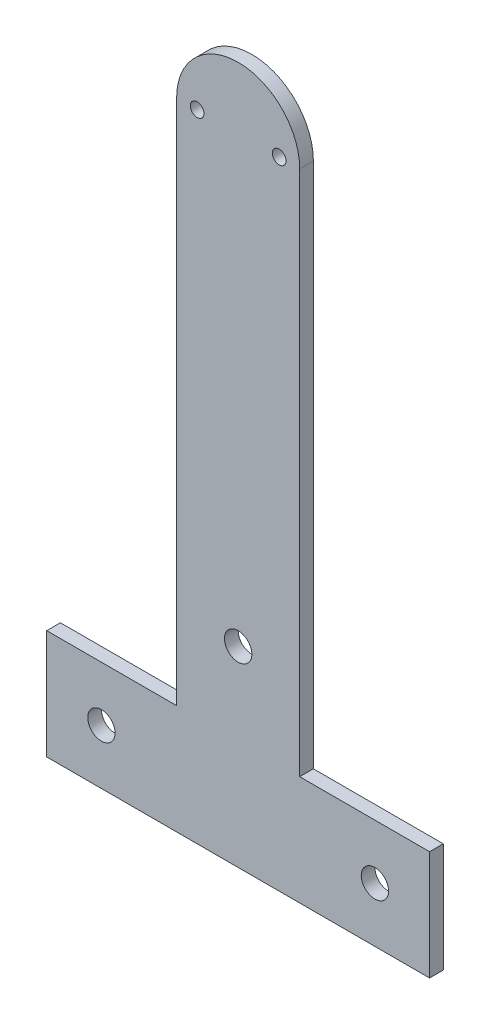
ISO-10303-21;
HEADER;
FILE_DESCRIPTION(('STEP AP214'),'2;1');
FILE_NAME('part.step','',(''),(''),'','','');
FILE_SCHEMA(('AUTOMOTIVE_DESIGN { 1 0 10303 214 1 1 1 1 }'));
ENDSEC;
DATA;
#1=APPLICATION_CONTEXT('core data for automotive mechanical design processes');
#2=APPLICATION_PROTOCOL_DEFINITION('international standard','automotive_design',2000,#1);
#3=PRODUCT_CONTEXT('',#1,'mechanical');
#4=PRODUCT('Part','Part','',(#3));
#5=PRODUCT_RELATED_PRODUCT_CATEGORY('part','',(#4));
#6=PRODUCT_DEFINITION_FORMATION('','',#4);
#7=PRODUCT_DEFINITION_CONTEXT('part definition',#1,'design');
#8=PRODUCT_DEFINITION('design','',#6,#7);
#9=PRODUCT_DEFINITION_SHAPE('','',#8);
#10=(LENGTH_UNIT() NAMED_UNIT(*) SI_UNIT(.MILLI.,.METRE.));
#11=(NAMED_UNIT(*) PLANE_ANGLE_UNIT() SI_UNIT($,.RADIAN.));
#12=(NAMED_UNIT(*) SI_UNIT($,.STERADIAN.) SOLID_ANGLE_UNIT());
#13=UNCERTAINTY_MEASURE_WITH_UNIT(LENGTH_MEASURE(1.E-05),#10,'distance_accuracy_value','');
#14=(GEOMETRIC_REPRESENTATION_CONTEXT(3) GLOBAL_UNCERTAINTY_ASSIGNED_CONTEXT((#13)) GLOBAL_UNIT_ASSIGNED_CONTEXT((#10,
#11,#12)) REPRESENTATION_CONTEXT('',''));
#15=CARTESIAN_POINT('',(0.,0.,0.));
#16=DIRECTION('',(0.,0.,1.));
#17=DIRECTION('',(1.,0.,0.));
#18=AXIS2_PLACEMENT_3D('',#15,#16,#17);
#19=CARTESIAN_POINT('',(-13.3404490284892,112.565520937774,2.));
#20=DIRECTION('',(0.,0.,-1.));
#21=DIRECTION('',(-1.,0.,0.));
#22=AXIS2_PLACEMENT_3D('',#19,#20,#21);
#23=PLANE('',#22);
#24=DIRECTION('',(1.,0.,0.));
#25=VECTOR('',#24,1.);
#26=CARTESIAN_POINT('',(-41.3404490284892,19.5655209377735,2.));
#27=LINE('',#26,#25);
#28=CARTESIAN_POINT('',(-41.3404490284892,19.5655209377735,2.));
#29=VERTEX_POINT('',#28);
#30=CARTESIAN_POINT('',(14.6595509715108,19.5655209377735,2.));
#31=VERTEX_POINT('',#30);
#32=EDGE_CURVE('E164',#29,#31,#27,.T.);
#33=ORIENTED_EDGE('',*,*,#32,.T.);
#34=DIRECTION('',(0.,1.,0.));
#35=VECTOR('',#34,1.);
#36=CARTESIAN_POINT('',(14.6595509715108,19.5655209377735,2.));
#37=LINE('',#36,#35);
#38=CARTESIAN_POINT('',(14.6595509715108,35.5655209377735,2.));
#39=VERTEX_POINT('',#38);
#40=EDGE_CURVE('E100',#31,#39,#37,.T.);
#41=ORIENTED_EDGE('',*,*,#40,.T.);
#42=DIRECTION('',(-1.,0.,0.));
#43=VECTOR('',#42,1.);
#44=CARTESIAN_POINT('',(-4.34044902848922,35.5655209377735,2.));
#45=LINE('',#44,#43);
#46=CARTESIAN_POINT('',(-4.34044902848922,35.5655209377735,2.));
#47=VERTEX_POINT('',#46);
#48=EDGE_CURVE('E185',#39,#47,#45,.T.);
#49=ORIENTED_EDGE('',*,*,#48,.T.);
#50=DIRECTION('',(0.,1.,0.));
#51=VECTOR('',#50,1.);
#52=CARTESIAN_POINT('',(-4.34044902848921,112.565520937774,2.));
#53=LINE('',#52,#51);
#54=CARTESIAN_POINT('',(-4.34044902848921,112.565520937774,2.));
#55=VERTEX_POINT('',#54);
#56=EDGE_CURVE('E199',#47,#55,#53,.T.);
#57=ORIENTED_EDGE('',*,*,#56,.T.);
#58=CARTESIAN_POINT('',(-13.3404490284892,112.565520937774,2.));
#59=DIRECTION('',(0.,0.,1.));
#60=DIRECTION('',(-1.,0.,0.));
#61=AXIS2_PLACEMENT_3D('',#58,#59,#60);
#62=CIRCLE('',#61,9.00000000000001);
#63=CARTESIAN_POINT('',(-22.3404490284892,112.565520937774,2.));
#64=VERTEX_POINT('',#63);
#65=EDGE_CURVE('E119',#55,#64,#62,.T.);
#66=ORIENTED_EDGE('',*,*,#65,.T.);
#67=DIRECTION('',(0.,-1.,0.));
#68=VECTOR('',#67,1.);
#69=CARTESIAN_POINT('',(-22.3404490284892,112.565520937774,2.));
#70=LINE('',#69,#68);
#71=CARTESIAN_POINT('',(-22.3404490284892,35.5655209377735,2.));
#72=VERTEX_POINT('',#71);
#73=EDGE_CURVE('E113',#64,#72,#70,.T.);
#74=ORIENTED_EDGE('',*,*,#73,.T.);
#75=DIRECTION('',(-1.,0.,0.));
#76=VECTOR('',#75,1.);
#77=CARTESIAN_POINT('',(-41.3404490284892,35.5655209377735,2.));
#78=LINE('',#77,#76);
#79=CARTESIAN_POINT('',(-41.3404490284892,35.5655209377735,2.));
#80=VERTEX_POINT('',#79);
#81=EDGE_CURVE('E117',#72,#80,#78,.T.);
#82=ORIENTED_EDGE('',*,*,#81,.T.);
#83=DIRECTION('',(0.,-1.,0.));
#84=VECTOR('',#83,1.);
#85=CARTESIAN_POINT('',(-41.3404490284892,19.5655209377735,2.));
#86=LINE('',#85,#84);
#87=EDGE_CURVE('E57',#80,#29,#86,.T.);
#88=ORIENTED_EDGE('',*,*,#87,.T.);
#89=EDGE_LOOP('',(#33,#41,#49,#57,#66,#74,#82,#88));
#90=FACE_BOUND('',#89,.T.);
#91=CARTESIAN_POINT('',(-33.3404490284892,27.5655209377735,2.));
#92=DIRECTION('',(0.,0.,1.));
#93=DIRECTION('',(1.,0.,0.));
#94=AXIS2_PLACEMENT_3D('',#91,#92,#93);
#95=CIRCLE('',#94,2.);
#96=CARTESIAN_POINT('',(-31.3404490284892,27.5655209377735,2.));
#97=VERTEX_POINT('',#96);
#98=EDGE_CURVE('E146',#97,#97,#95,.T.);
#99=ORIENTED_EDGE('',*,*,#98,.F.);
#100=EDGE_LOOP('',(#99));
#101=FACE_BOUND('',#100,.T.);
#102=CARTESIAN_POINT('',(6.65955097151078,27.5655209377735,2.));
#103=DIRECTION('',(0.,0.,1.));
#104=DIRECTION('',(-1.,0.,0.));
#105=AXIS2_PLACEMENT_3D('',#102,#103,#104);
#106=CIRCLE('',#105,2.00000000000001);
#107=CARTESIAN_POINT('',(4.65955097151077,27.5655209377735,2.));
#108=VERTEX_POINT('',#107);
#109=EDGE_CURVE('E213',#108,#108,#106,.T.);
#110=ORIENTED_EDGE('',*,*,#109,.F.);
#111=EDGE_LOOP('',(#110));
#112=FACE_BOUND('',#111,.T.);
#113=CARTESIAN_POINT('',(-7.34044902848922,112.565520937774,2.));
#114=DIRECTION('',(0.,0.,1.));
#115=DIRECTION('',(1.,0.,0.));
#116=AXIS2_PLACEMENT_3D('',#113,#114,#115);
#117=CIRCLE('',#116,1.);
#118=CARTESIAN_POINT('',(-6.34044902848922,112.565520937774,2.));
#119=VERTEX_POINT('',#118);
#120=EDGE_CURVE('E221',#119,#119,#117,.T.);
#121=ORIENTED_EDGE('',*,*,#120,.F.);
#122=EDGE_LOOP('',(#121));
#123=FACE_BOUND('',#122,.T.);
#124=CARTESIAN_POINT('',(-19.3404490284892,112.565520937774,2.));
#125=DIRECTION('',(0.,0.,1.));
#126=DIRECTION('',(-1.,0.,0.));
#127=AXIS2_PLACEMENT_3D('',#124,#125,#126);
#128=CIRCLE('',#127,1.);
#129=CARTESIAN_POINT('',(-20.3404490284892,112.565520937774,2.));
#130=VERTEX_POINT('',#129);
#131=EDGE_CURVE('E229',#130,#130,#128,.T.);
#132=ORIENTED_EDGE('',*,*,#131,.F.);
#133=EDGE_LOOP('',(#132));
#134=FACE_BOUND('',#133,.T.);
#135=CARTESIAN_POINT('',(-13.3404490284892,47.5655209377735,2.));
#136=DIRECTION('',(0.,0.,1.));
#137=DIRECTION('',(1.,0.,0.));
#138=AXIS2_PLACEMENT_3D('',#135,#136,#137);
#139=CIRCLE('',#138,2.00000000000001);
#140=CARTESIAN_POINT('',(-11.3404490284892,47.5655209377735,2.));
#141=VERTEX_POINT('',#140);
#142=EDGE_CURVE('E237',#141,#141,#139,.T.);
#143=ORIENTED_EDGE('',*,*,#142,.F.);
#144=EDGE_LOOP('',(#143));
#145=FACE_BOUND('',#144,.T.);
#146=ADVANCED_FACE('F39',(#90,#101,#112,#123,#134,#145),#23,.F.);
#147=CARTESIAN_POINT('',(-13.3404490284892,112.565520937774,0.));
#148=DIRECTION('',(0.,0.,-1.));
#149=DIRECTION('',(-1.,0.,0.));
#150=AXIS2_PLACEMENT_3D('',#147,#148,#149);
#151=PLANE('',#150);
#152=CARTESIAN_POINT('',(-19.3404490284892,112.565520937774,0.));
#153=DIRECTION('',(0.,0.,1.));
#154=DIRECTION('',(-1.,0.,0.));
#155=AXIS2_PLACEMENT_3D('',#152,#153,#154);
#156=CIRCLE('',#155,1.);
#157=CARTESIAN_POINT('',(-20.3404490284892,112.565520937774,0.));
#158=VERTEX_POINT('',#157);
#159=EDGE_CURVE('E233',#158,#158,#156,.T.);
#160=ORIENTED_EDGE('',*,*,#159,.T.);
#161=EDGE_LOOP('',(#160));
#162=FACE_BOUND('',#161,.T.);
#163=CARTESIAN_POINT('',(6.65955097151078,27.5655209377735,0.));
#164=DIRECTION('',(0.,0.,1.));
#165=DIRECTION('',(-1.,0.,0.));
#166=AXIS2_PLACEMENT_3D('',#163,#164,#165);
#167=CIRCLE('',#166,2.00000000000001);
#168=CARTESIAN_POINT('',(4.65955097151077,27.5655209377735,0.));
#169=VERTEX_POINT('',#168);
#170=EDGE_CURVE('E217',#169,#169,#167,.T.);
#171=ORIENTED_EDGE('',*,*,#170,.T.);
#172=EDGE_LOOP('',(#171));
#173=FACE_BOUND('',#172,.T.);
#174=DIRECTION('',(1.,0.,0.));
#175=VECTOR('',#174,1.);
#176=CARTESIAN_POINT('',(-41.3404490284892,19.5655209377735,0.));
#177=LINE('',#176,#175);
#178=CARTESIAN_POINT('',(-41.3404490284892,19.5655209377735,0.));
#179=VERTEX_POINT('',#178);
#180=CARTESIAN_POINT('',(14.6595509715108,19.5655209377735,0.));
#181=VERTEX_POINT('',#180);
#182=EDGE_CURVE('E141',#179,#181,#177,.T.);
#183=ORIENTED_EDGE('',*,*,#182,.F.);
#184=DIRECTION('',(0.,-1.,0.));
#185=VECTOR('',#184,1.);
#186=CARTESIAN_POINT('',(-41.3404490284892,19.5655209377735,0.));
#187=LINE('',#186,#185);
#188=CARTESIAN_POINT('',(-41.3404490284892,35.5655209377735,0.));
#189=VERTEX_POINT('',#188);
#190=EDGE_CURVE('E92',#189,#179,#187,.T.);
#191=ORIENTED_EDGE('',*,*,#190,.F.);
#192=DIRECTION('',(-1.,0.,0.));
#193=VECTOR('',#192,1.);
#194=CARTESIAN_POINT('',(-41.3404490284892,35.5655209377735,0.));
#195=LINE('',#194,#193);
#196=CARTESIAN_POINT('',(-22.3404490284892,35.5655209377735,0.));
#197=VERTEX_POINT('',#196);
#198=EDGE_CURVE('E86',#197,#189,#195,.T.);
#199=ORIENTED_EDGE('',*,*,#198,.F.);
#200=DIRECTION('',(0.,-1.,0.));
#201=VECTOR('',#200,1.);
#202=CARTESIAN_POINT('',(-22.3404490284892,112.565520937774,0.));
#203=LINE('',#202,#201);
#204=CARTESIAN_POINT('',(-22.3404490284892,112.565520937774,0.));
#205=VERTEX_POINT('',#204);
#206=EDGE_CURVE('E128',#205,#197,#203,.T.);
#207=ORIENTED_EDGE('',*,*,#206,.F.);
#208=CARTESIAN_POINT('',(-13.3404490284892,112.565520937774,0.));
#209=DIRECTION('',(0.,0.,1.));
#210=DIRECTION('',(-1.,0.,0.));
#211=AXIS2_PLACEMENT_3D('',#208,#209,#210);
#212=CIRCLE('',#211,9.00000000000001);
#213=CARTESIAN_POINT('',(-4.34044902848921,112.565520937774,0.));
#214=VERTEX_POINT('',#213);
#215=EDGE_CURVE('E155',#214,#205,#212,.T.);
#216=ORIENTED_EDGE('',*,*,#215,.F.);
#217=DIRECTION('',(0.,1.,0.));
#218=VECTOR('',#217,1.);
#219=CARTESIAN_POINT('',(-4.34044902848921,112.565520937774,0.));
#220=LINE('',#219,#218);
#221=CARTESIAN_POINT('',(-4.34044902848922,35.5655209377735,0.));
#222=VERTEX_POINT('',#221);
#223=EDGE_CURVE('E152',#222,#214,#220,.T.);
#224=ORIENTED_EDGE('',*,*,#223,.F.);
#225=DIRECTION('',(-1.,0.,0.));
#226=VECTOR('',#225,1.);
#227=CARTESIAN_POINT('',(-4.34044902848922,35.5655209377735,0.));
#228=LINE('',#227,#226);
#229=CARTESIAN_POINT('',(14.6595509715108,35.5655209377735,0.));
#230=VERTEX_POINT('',#229);
#231=EDGE_CURVE('E149',#230,#222,#228,.T.);
#232=ORIENTED_EDGE('',*,*,#231,.F.);
#233=DIRECTION('',(0.,1.,0.));
#234=VECTOR('',#233,1.);
#235=CARTESIAN_POINT('',(14.6595509715108,19.5655209377735,0.));
#236=LINE('',#235,#234);
#237=EDGE_CURVE('E145',#181,#230,#236,.T.);
#238=ORIENTED_EDGE('',*,*,#237,.F.);
#239=EDGE_LOOP('',(#183,#191,#199,#207,#216,#224,#232,#238));
#240=FACE_BOUND('',#239,.T.);
#241=CARTESIAN_POINT('',(-33.3404490284892,27.5655209377735,0.));
#242=DIRECTION('',(0.,0.,1.));
#243=DIRECTION('',(1.,0.,0.));
#244=AXIS2_PLACEMENT_3D('',#241,#242,#243);
#245=CIRCLE('',#244,2.);
#246=CARTESIAN_POINT('',(-31.3404490284892,27.5655209377735,0.));
#247=VERTEX_POINT('',#246);
#248=EDGE_CURVE('E209',#247,#247,#245,.T.);
#249=ORIENTED_EDGE('',*,*,#248,.T.);
#250=EDGE_LOOP('',(#249));
#251=FACE_BOUND('',#250,.T.);
#252=CARTESIAN_POINT('',(-7.34044902848922,112.565520937774,0.));
#253=DIRECTION('',(0.,0.,1.));
#254=DIRECTION('',(1.,0.,0.));
#255=AXIS2_PLACEMENT_3D('',#252,#253,#254);
#256=CIRCLE('',#255,1.);
#257=CARTESIAN_POINT('',(-6.34044902848922,112.565520937774,0.));
#258=VERTEX_POINT('',#257);
#259=EDGE_CURVE('E225',#258,#258,#256,.T.);
#260=ORIENTED_EDGE('',*,*,#259,.T.);
#261=EDGE_LOOP('',(#260));
#262=FACE_BOUND('',#261,.T.);
#263=CARTESIAN_POINT('',(-13.3404490284892,47.5655209377735,0.));
#264=DIRECTION('',(0.,0.,1.));
#265=DIRECTION('',(1.,0.,0.));
#266=AXIS2_PLACEMENT_3D('',#263,#264,#265);
#267=CIRCLE('',#266,2.00000000000001);
#268=CARTESIAN_POINT('',(-11.3404490284892,47.5655209377735,0.));
#269=VERTEX_POINT('',#268);
#270=EDGE_CURVE('E241',#269,#269,#267,.T.);
#271=ORIENTED_EDGE('',*,*,#270,.T.);
#272=EDGE_LOOP('',(#271));
#273=FACE_BOUND('',#272,.T.);
#274=ADVANCED_FACE('F189',(#162,#173,#240,#251,#262,#273),#151,.T.);
#275=CARTESIAN_POINT('',(-41.3404490284892,19.5655209377735,2.));
#276=DIRECTION('',(0.,1.,0.));
#277=DIRECTION('',(0.,0.,1.));
#278=AXIS2_PLACEMENT_3D('',#275,#276,#277);
#279=PLANE('',#278);
#280=ORIENTED_EDGE('',*,*,#182,.T.);
#281=DIRECTION('',(0.,0.,-1.));
#282=VECTOR('',#281,1.);
#283=CARTESIAN_POINT('',(14.6595509715108,19.5655209377735,2.));
#284=LINE('',#283,#282);
#285=EDGE_CURVE('E11',#31,#181,#284,.T.);
#286=ORIENTED_EDGE('',*,*,#285,.F.);
#287=ORIENTED_EDGE('',*,*,#32,.F.);
#288=DIRECTION('',(0.,0.,-1.));
#289=VECTOR('',#288,1.);
#290=CARTESIAN_POINT('',(-41.3404490284892,19.5655209377735,2.));
#291=LINE('',#290,#289);
#292=EDGE_CURVE('E137',#29,#179,#291,.T.);
#293=ORIENTED_EDGE('',*,*,#292,.T.);
#294=EDGE_LOOP('',(#280,#286,#287,#293));
#295=FACE_BOUND('',#294,.T.);
#296=ADVANCED_FACE('F41',(#295),#279,.F.);
#297=CARTESIAN_POINT('',(14.6595509715108,19.5655209377735,2.));
#298=DIRECTION('',(-1.,0.,0.));
#299=DIRECTION('',(0.,0.,1.));
#300=AXIS2_PLACEMENT_3D('',#297,#298,#299);
#301=PLANE('',#300);
#302=ORIENTED_EDGE('',*,*,#237,.T.);
#303=DIRECTION('',(0.,0.,-1.));
#304=VECTOR('',#303,1.);
#305=CARTESIAN_POINT('',(14.6595509715108,35.5655209377735,2.));
#306=LINE('',#305,#304);
#307=EDGE_CURVE('E49',#39,#230,#306,.T.);
#308=ORIENTED_EDGE('',*,*,#307,.F.);
#309=ORIENTED_EDGE('',*,*,#40,.F.);
#310=ORIENTED_EDGE('',*,*,#285,.T.);
#311=EDGE_LOOP('',(#302,#308,#309,#310));
#312=FACE_BOUND('',#311,.T.);
#313=ADVANCED_FACE('F275',(#312),#301,.F.);
#314=CARTESIAN_POINT('',(-4.34044902848922,35.5655209377735,2.));
#315=DIRECTION('',(0.,-1.,0.));
#316=DIRECTION('',(0.,0.,-1.));
#317=AXIS2_PLACEMENT_3D('',#314,#315,#316);
#318=PLANE('',#317);
#319=ORIENTED_EDGE('',*,*,#231,.T.);
#320=DIRECTION('',(0.,0.,-1.));
#321=VECTOR('',#320,1.);
#322=CARTESIAN_POINT('',(-4.34044902848922,35.5655209377735,2.));
#323=LINE('',#322,#321);
#324=EDGE_CURVE('E175',#47,#222,#323,.T.);
#325=ORIENTED_EDGE('',*,*,#324,.F.);
#326=ORIENTED_EDGE('',*,*,#48,.F.);
#327=ORIENTED_EDGE('',*,*,#307,.T.);
#328=EDGE_LOOP('',(#319,#325,#326,#327));
#329=FACE_BOUND('',#328,.T.);
#330=ADVANCED_FACE('F183',(#329),#318,.F.);
#331=CARTESIAN_POINT('',(-4.34044902848921,112.565520937774,2.));
#332=DIRECTION('',(-1.,0.,0.));
#333=DIRECTION('',(0.,-1.,0.));
#334=AXIS2_PLACEMENT_3D('',#331,#332,#333);
#335=PLANE('',#334);
#336=ORIENTED_EDGE('',*,*,#223,.T.);
#337=DIRECTION('',(0.,0.,-1.));
#338=VECTOR('',#337,1.);
#339=CARTESIAN_POINT('',(-4.34044902848921,112.565520937774,2.));
#340=LINE('',#339,#338);
#341=EDGE_CURVE('E171',#55,#214,#340,.T.);
#342=ORIENTED_EDGE('',*,*,#341,.F.);
#343=ORIENTED_EDGE('',*,*,#56,.F.);
#344=ORIENTED_EDGE('',*,*,#324,.T.);
#345=EDGE_LOOP('',(#336,#342,#343,#344));
#346=FACE_BOUND('',#345,.T.);
#347=ADVANCED_FACE('F194',(#346),#335,.F.);
#348=CARTESIAN_POINT('',(-13.3404490284892,112.565520937774,2.));
#349=DIRECTION('',(0.,0.,-1.));
#350=DIRECTION('',(-1.,0.,0.));
#351=AXIS2_PLACEMENT_3D('',#348,#349,#350);
#352=CYLINDRICAL_SURFACE('',#351,9.00000000000001);
#353=ORIENTED_EDGE('',*,*,#215,.T.);
#354=DIRECTION('',(0.,0.,-1.));
#355=VECTOR('',#354,1.);
#356=CARTESIAN_POINT('',(-22.3404490284892,112.565520937774,2.));
#357=LINE('',#356,#355);
#358=EDGE_CURVE('E130',#64,#205,#357,.T.);
#359=ORIENTED_EDGE('',*,*,#358,.F.);
#360=ORIENTED_EDGE('',*,*,#65,.F.);
#361=ORIENTED_EDGE('',*,*,#341,.T.);
#362=EDGE_LOOP('',(#353,#359,#360,#361));
#363=FACE_BOUND('',#362,.T.);
#364=ADVANCED_FACE('F197',(#363),#352,.T.);
#365=CARTESIAN_POINT('',(-22.3404490284892,112.565520937774,2.));
#366=DIRECTION('',(1.,0.,0.));
#367=DIRECTION('',(0.,1.,0.));
#368=AXIS2_PLACEMENT_3D('',#365,#366,#367);
#369=PLANE('',#368);
#370=ORIENTED_EDGE('',*,*,#206,.T.);
#371=DIRECTION('',(0.,0.,-1.));
#372=VECTOR('',#371,1.);
#373=CARTESIAN_POINT('',(-22.3404490284892,35.5655209377735,2.));
#374=LINE('',#373,#372);
#375=EDGE_CURVE('E125',#72,#197,#374,.T.);
#376=ORIENTED_EDGE('',*,*,#375,.F.);
#377=ORIENTED_EDGE('',*,*,#73,.F.);
#378=ORIENTED_EDGE('',*,*,#358,.T.);
#379=EDGE_LOOP('',(#370,#376,#377,#378));
#380=FACE_BOUND('',#379,.T.);
#381=ADVANCED_FACE('F126',(#380),#369,.F.);
#382=CARTESIAN_POINT('',(-41.3404490284892,35.5655209377735,2.));
#383=DIRECTION('',(0.,-1.,0.));
#384=DIRECTION('',(0.,0.,-1.));
#385=AXIS2_PLACEMENT_3D('',#382,#383,#384);
#386=PLANE('',#385);
#387=ORIENTED_EDGE('',*,*,#198,.T.);
#388=DIRECTION('',(0.,0.,-1.));
#389=VECTOR('',#388,1.);
#390=CARTESIAN_POINT('',(-41.3404490284892,35.5655209377735,2.));
#391=LINE('',#390,#389);
#392=EDGE_CURVE('E131',#80,#189,#391,.T.);
#393=ORIENTED_EDGE('',*,*,#392,.F.);
#394=ORIENTED_EDGE('',*,*,#81,.F.);
#395=ORIENTED_EDGE('',*,*,#375,.T.);
#396=EDGE_LOOP('',(#387,#393,#394,#395));
#397=FACE_BOUND('',#396,.T.);
#398=ADVANCED_FACE('F133',(#397),#386,.F.);
#399=CARTESIAN_POINT('',(-41.3404490284892,19.5655209377735,2.));
#400=DIRECTION('',(1.,0.,0.));
#401=DIRECTION('',(0.,0.,-1.));
#402=AXIS2_PLACEMENT_3D('',#399,#400,#401);
#403=PLANE('',#402);
#404=ORIENTED_EDGE('',*,*,#190,.T.);
#405=ORIENTED_EDGE('',*,*,#292,.F.);
#406=ORIENTED_EDGE('',*,*,#87,.F.);
#407=ORIENTED_EDGE('',*,*,#392,.T.);
#408=EDGE_LOOP('',(#404,#405,#406,#407));
#409=FACE_BOUND('',#408,.T.);
#410=ADVANCED_FACE('F263',(#409),#403,.F.);
#411=CARTESIAN_POINT('',(-33.3404490284892,27.5655209377735,2.));
#412=DIRECTION('',(0.,0.,-1.));
#413=DIRECTION('',(-1.,0.,0.));
#414=AXIS2_PLACEMENT_3D('',#411,#412,#413);
#415=CYLINDRICAL_SURFACE('',#414,2.);
#416=ORIENTED_EDGE('',*,*,#98,.T.);
#417=EDGE_LOOP('',(#416));
#418=FACE_BOUND('',#417,.T.);
#419=ORIENTED_EDGE('',*,*,#248,.F.);
#420=EDGE_LOOP('',(#419));
#421=FACE_BOUND('',#420,.T.);
#422=ADVANCED_FACE('F260',(#418,#421),#415,.F.);
#423=CARTESIAN_POINT('',(6.65955097151078,27.5655209377735,2.));
#424=DIRECTION('',(0.,0.,-1.));
#425=DIRECTION('',(-1.,0.,0.));
#426=AXIS2_PLACEMENT_3D('',#423,#424,#425);
#427=CYLINDRICAL_SURFACE('',#426,2.00000000000001);
#428=ORIENTED_EDGE('',*,*,#109,.T.);
#429=EDGE_LOOP('',(#428));
#430=FACE_BOUND('',#429,.T.);
#431=ORIENTED_EDGE('',*,*,#170,.F.);
#432=EDGE_LOOP('',(#431));
#433=FACE_BOUND('',#432,.T.);
#434=ADVANCED_FACE('F339',(#430,#433),#427,.F.);
#435=CARTESIAN_POINT('',(-7.34044902848922,112.565520937774,2.));
#436=DIRECTION('',(0.,0.,-1.));
#437=DIRECTION('',(-1.,0.,0.));
#438=AXIS2_PLACEMENT_3D('',#435,#436,#437);
#439=CYLINDRICAL_SURFACE('',#438,1.);
#440=ORIENTED_EDGE('',*,*,#120,.T.);
#441=EDGE_LOOP('',(#440));
#442=FACE_BOUND('',#441,.T.);
#443=ORIENTED_EDGE('',*,*,#259,.F.);
#444=EDGE_LOOP('',(#443));
#445=FACE_BOUND('',#444,.T.);
#446=ADVANCED_FACE('F347',(#442,#445),#439,.F.);
#447=CARTESIAN_POINT('',(-19.3404490284892,112.565520937774,2.));
#448=DIRECTION('',(0.,0.,-1.));
#449=DIRECTION('',(-1.,0.,0.));
#450=AXIS2_PLACEMENT_3D('',#447,#448,#449);
#451=CYLINDRICAL_SURFACE('',#450,1.);
#452=ORIENTED_EDGE('',*,*,#131,.T.);
#453=EDGE_LOOP('',(#452));
#454=FACE_BOUND('',#453,.T.);
#455=ORIENTED_EDGE('',*,*,#159,.F.);
#456=EDGE_LOOP('',(#455));
#457=FACE_BOUND('',#456,.T.);
#458=ADVANCED_FACE('F355',(#454,#457),#451,.F.);
#459=CARTESIAN_POINT('',(-13.3404490284892,47.5655209377735,2.));
#460=DIRECTION('',(0.,0.,-1.));
#461=DIRECTION('',(-1.,0.,0.));
#462=AXIS2_PLACEMENT_3D('',#459,#460,#461);
#463=CYLINDRICAL_SURFACE('',#462,2.00000000000001);
#464=ORIENTED_EDGE('',*,*,#142,.T.);
#465=EDGE_LOOP('',(#464));
#466=FACE_BOUND('',#465,.T.);
#467=ORIENTED_EDGE('',*,*,#270,.F.);
#468=EDGE_LOOP('',(#467));
#469=FACE_BOUND('',#468,.T.);
#470=ADVANCED_FACE('F249',(#466,#469),#463,.F.);
#471=CLOSED_SHELL('',(#146,#274,#296,#313,#330,#347,#364,#381,#398,#410,#422,#434,#446,#458,#470));
#472=MANIFOLD_SOLID_BREP('B2',#471);
#473=ADVANCED_BREP_SHAPE_REPRESENTATION('',(#18,#472),#14);
#474=SHAPE_DEFINITION_REPRESENTATION(#9,#473);
ENDSEC;
END-ISO-10303-21;
